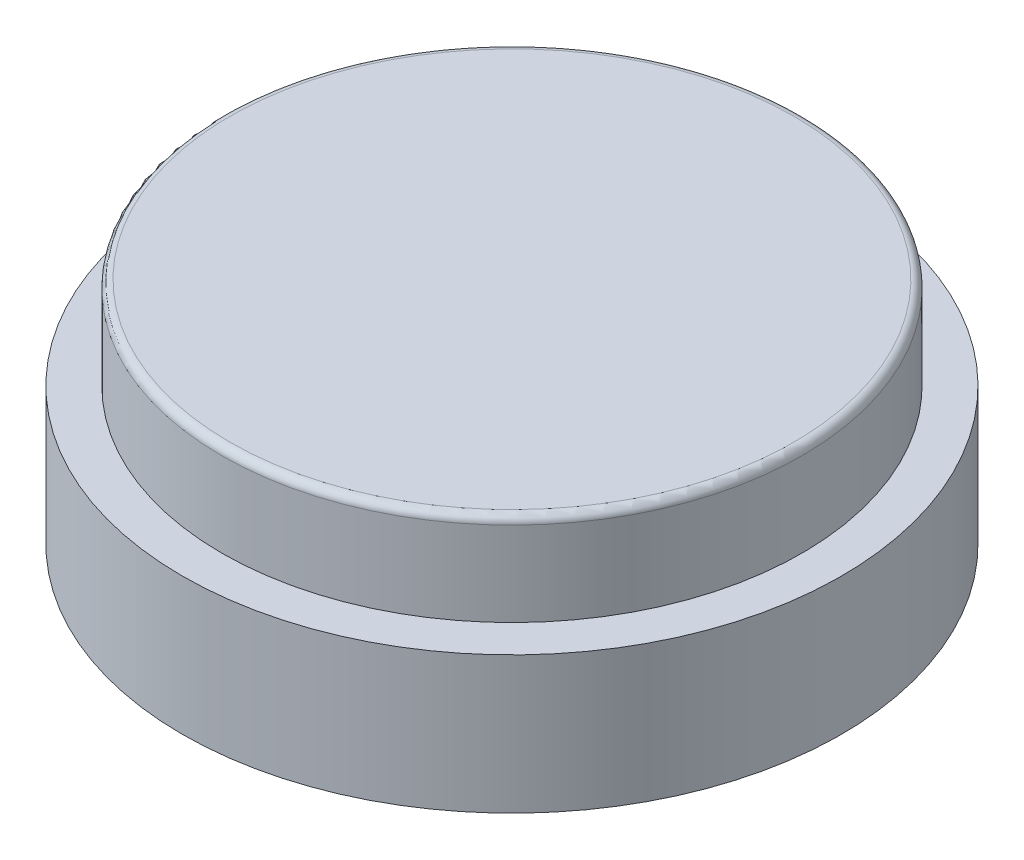
ISO-10303-21;
HEADER;
FILE_DESCRIPTION(('STEP AP214'),'2;1');
FILE_NAME('part.step','',(''),(''),'','','');
FILE_SCHEMA(('AUTOMOTIVE_DESIGN { 1 0 10303 214 1 1 1 1 }'));
ENDSEC;
DATA;
#1=APPLICATION_CONTEXT('core data for automotive mechanical design processes');
#2=APPLICATION_PROTOCOL_DEFINITION('international standard','automotive_design',2000,#1);
#3=PRODUCT_CONTEXT('',#1,'mechanical');
#4=PRODUCT('Part','Part','',(#3));
#5=PRODUCT_RELATED_PRODUCT_CATEGORY('part','',(#4));
#6=PRODUCT_DEFINITION_FORMATION('','',#4);
#7=PRODUCT_DEFINITION_CONTEXT('part definition',#1,'design');
#8=PRODUCT_DEFINITION('design','',#6,#7);
#9=PRODUCT_DEFINITION_SHAPE('','',#8);
#10=(LENGTH_UNIT() NAMED_UNIT(*) SI_UNIT(.MILLI.,.METRE.));
#11=(NAMED_UNIT(*) PLANE_ANGLE_UNIT() SI_UNIT($,.RADIAN.));
#12=(NAMED_UNIT(*) SI_UNIT($,.STERADIAN.) SOLID_ANGLE_UNIT());
#13=UNCERTAINTY_MEASURE_WITH_UNIT(LENGTH_MEASURE(1.E-05),#10,'distance_accuracy_value','');
#14=(GEOMETRIC_REPRESENTATION_CONTEXT(3) GLOBAL_UNCERTAINTY_ASSIGNED_CONTEXT((#13)) GLOBAL_UNIT_ASSIGNED_CONTEXT((#10,
#11,#12)) REPRESENTATION_CONTEXT('',''));
#15=CARTESIAN_POINT('',(0.,0.,0.));
#16=DIRECTION('',(0.,0.,1.));
#17=DIRECTION('',(1.,0.,0.));
#18=AXIS2_PLACEMENT_3D('',#15,#16,#17);
#19=CARTESIAN_POINT('',(0.,5.2,0.));
#20=DIRECTION('',(0.,1.,0.));
#21=DIRECTION('',(0.,0.,1.));
#22=AXIS2_PLACEMENT_3D('',#19,#20,#21);
#23=PLANE('',#22);
#24=CARTESIAN_POINT('',(0.,5.2,0.));
#25=DIRECTION('',(0.,1.,0.));
#26=DIRECTION('',(0.,0.,1.));
#27=AXIS2_PLACEMENT_3D('',#24,#25,#26);
#28=CIRCLE('',#27,12.5);
#29=CARTESIAN_POINT('',(0.,5.2,12.5));
#30=VERTEX_POINT('',#29);
#31=EDGE_CURVE('E52',#30,#30,#28,.T.);
#32=ORIENTED_EDGE('',*,*,#31,.T.);
#33=EDGE_LOOP('',(#32));
#34=FACE_BOUND('',#33,.T.);
#35=CARTESIAN_POINT('',(0.,5.2,0.));
#36=DIRECTION('',(0.,1.,0.));
#37=DIRECTION('',(0.,0.,1.));
#38=AXIS2_PLACEMENT_3D('',#35,#36,#37);
#39=CIRCLE('',#38,11.);
#40=CARTESIAN_POINT('',(0.,5.2,11.));
#41=VERTEX_POINT('',#40);
#42=EDGE_CURVE('E62',#41,#41,#39,.T.);
#43=ORIENTED_EDGE('',*,*,#42,.F.);
#44=EDGE_LOOP('',(#43));
#45=FACE_BOUND('',#44,.T.);
#46=ADVANCED_FACE('F39',(#34,#45),#23,.T.);
#47=CARTESIAN_POINT('',(0.,5.2,0.));
#48=DIRECTION('',(0.,-1.,0.));
#49=DIRECTION('',(0.,0.,-1.));
#50=AXIS2_PLACEMENT_3D('',#47,#48,#49);
#51=CYLINDRICAL_SURFACE('',#50,12.5);
#52=ORIENTED_EDGE('',*,*,#31,.F.);
#53=EDGE_LOOP('',(#52));
#54=FACE_BOUND('',#53,.T.);
#55=CARTESIAN_POINT('',(0.,0.,0.));
#56=DIRECTION('',(0.,1.,0.));
#57=DIRECTION('',(0.,0.,1.));
#58=AXIS2_PLACEMENT_3D('',#55,#56,#57);
#59=CIRCLE('',#58,12.5);
#60=CARTESIAN_POINT('',(0.,0.,12.5));
#61=VERTEX_POINT('',#60);
#62=EDGE_CURVE('E57',#61,#61,#59,.T.);
#63=ORIENTED_EDGE('',*,*,#62,.T.);
#64=EDGE_LOOP('',(#63));
#65=FACE_BOUND('',#64,.T.);
#66=ADVANCED_FACE('F71',(#54,#65),#51,.T.);
#67=CARTESIAN_POINT('',(0.,0.,0.));
#68=DIRECTION('',(0.,1.,0.));
#69=DIRECTION('',(0.,0.,1.));
#70=AXIS2_PLACEMENT_3D('',#67,#68,#69);
#71=PLANE('',#70);
#72=ORIENTED_EDGE('',*,*,#62,.F.);
#73=EDGE_LOOP('',(#72));
#74=FACE_BOUND('',#73,.T.);
#75=ADVANCED_FACE('F77',(#74),#71,.F.);
#76=CARTESIAN_POINT('',(0.,8.7,0.));
#77=DIRECTION('',(0.,-1.,0.));
#78=DIRECTION('',(0.,0.,-1.));
#79=AXIS2_PLACEMENT_3D('',#76,#77,#78);
#80=CYLINDRICAL_SURFACE('',#79,11.);
#81=CARTESIAN_POINT('',(0.,8.4,0.));
#82=DIRECTION('',(0.,1.,0.));
#83=DIRECTION('',(0.,0.,1.));
#84=AXIS2_PLACEMENT_3D('',#81,#82,#83);
#85=CIRCLE('',#84,11.);
#86=CARTESIAN_POINT('',(0.,8.4,11.));
#87=VERTEX_POINT('',#86);
#88=EDGE_CURVE('E10',#87,#87,#85,.F.);
#89=ORIENTED_EDGE('',*,*,#88,.T.);
#90=EDGE_LOOP('',(#89));
#91=FACE_BOUND('',#90,.T.);
#92=ORIENTED_EDGE('',*,*,#42,.T.);
#93=EDGE_LOOP('',(#92));
#94=FACE_BOUND('',#93,.T.);
#95=ADVANCED_FACE('F68',(#91,#94),#80,.T.);
#96=CARTESIAN_POINT('',(0.,8.7,0.));
#97=DIRECTION('',(0.,1.,0.));
#98=DIRECTION('',(0.,0.,1.));
#99=AXIS2_PLACEMENT_3D('',#96,#97,#98);
#100=PLANE('',#99);
#101=CARTESIAN_POINT('',(0.,8.7,0.));
#102=DIRECTION('',(0.,1.,0.));
#103=DIRECTION('',(0.,0.,1.));
#104=AXIS2_PLACEMENT_3D('',#101,#102,#103);
#105=CIRCLE('',#104,10.7);
#106=CARTESIAN_POINT('',(0.,8.7,10.7));
#107=VERTEX_POINT('',#106);
#108=EDGE_CURVE('E47',#107,#107,#105,.T.);
#109=ORIENTED_EDGE('',*,*,#108,.T.);
#110=EDGE_LOOP('',(#109));
#111=FACE_BOUND('',#110,.T.);
#112=ADVANCED_FACE('F87',(#111),#100,.T.);
#113=CARTESIAN_POINT('',(0.,8.4,0.));
#114=DIRECTION('',(0.,1.,0.));
#115=DIRECTION('',(0.,0.,1.));
#116=AXIS2_PLACEMENT_3D('',#113,#114,#115);
#117=TOROIDAL_SURFACE('',#116,10.7,0.3);
#118=ORIENTED_EDGE('',*,*,#88,.F.);
#119=EDGE_LOOP('',(#118));
#120=FACE_BOUND('',#119,.T.);
#121=ORIENTED_EDGE('',*,*,#108,.F.);
#122=EDGE_LOOP('',(#121));
#123=FACE_BOUND('',#122,.T.);
#124=ADVANCED_FACE('F41',(#120,#123),#117,.T.);
#125=CLOSED_SHELL('',(#46,#66,#75,#95,#112,#124));
#126=MANIFOLD_SOLID_BREP('B2',#125);
#127=ADVANCED_BREP_SHAPE_REPRESENTATION('',(#18,#126),#14);
#128=SHAPE_DEFINITION_REPRESENTATION(#9,#127);
ENDSEC;
END-ISO-10303-21;
